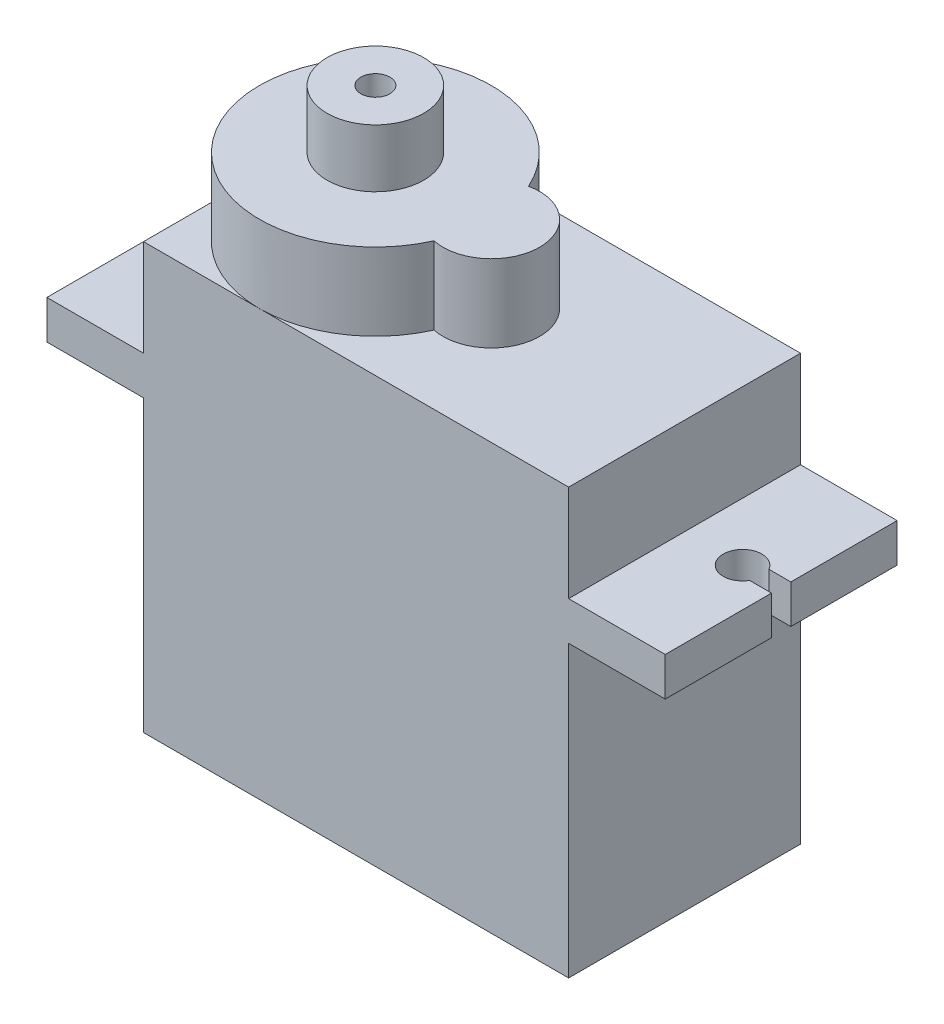
ISO-10303-21;
HEADER;
FILE_DESCRIPTION(('STEP AP214'),'2;1');
FILE_NAME('part.step','',(''),(''),'','','');
FILE_SCHEMA(('AUTOMOTIVE_DESIGN { 1 0 10303 214 1 1 1 1 }'));
ENDSEC;
DATA;
#1=APPLICATION_CONTEXT('core data for automotive mechanical design processes');
#2=APPLICATION_PROTOCOL_DEFINITION('international standard','automotive_design',2000,#1);
#3=PRODUCT_CONTEXT('',#1,'mechanical');
#4=PRODUCT('Part','Part','',(#3));
#5=PRODUCT_RELATED_PRODUCT_CATEGORY('part','',(#4));
#6=PRODUCT_DEFINITION_FORMATION('','',#4);
#7=PRODUCT_DEFINITION_CONTEXT('part definition',#1,'design');
#8=PRODUCT_DEFINITION('design','',#6,#7);
#9=PRODUCT_DEFINITION_SHAPE('','',#8);
#10=(LENGTH_UNIT() NAMED_UNIT(*) SI_UNIT(.MILLI.,.METRE.));
#11=(NAMED_UNIT(*) PLANE_ANGLE_UNIT() SI_UNIT($,.RADIAN.));
#12=(NAMED_UNIT(*) SI_UNIT($,.STERADIAN.) SOLID_ANGLE_UNIT());
#13=UNCERTAINTY_MEASURE_WITH_UNIT(LENGTH_MEASURE(1.E-05),#10,'distance_accuracy_value','');
#14=(GEOMETRIC_REPRESENTATION_CONTEXT(3) GLOBAL_UNCERTAINTY_ASSIGNED_CONTEXT((#13)) GLOBAL_UNIT_ASSIGNED_CONTEXT((#10,
#11,#12)) REPRESENTATION_CONTEXT('',''));
#15=CARTESIAN_POINT('',(0.,0.,0.));
#16=DIRECTION('',(0.,0.,1.));
#17=DIRECTION('',(1.,0.,0.));
#18=AXIS2_PLACEMENT_3D('',#15,#16,#17);
#19=CARTESIAN_POINT('',(-11.,17.,-11.3851648071345));
#20=DIRECTION('',(0.,-1.,0.));
#21=DIRECTION('',(1.,0.,0.));
#22=AXIS2_PLACEMENT_3D('',#19,#20,#21);
#23=PLANE('',#22);
#24=DIRECTION('',(-1.,0.,0.));
#25=VECTOR('',#24,1.);
#26=CARTESIAN_POINT('',(-16.,17.,0.5));
#27=LINE('',#26,#25);
#28=CARTESIAN_POINT('',(-14.8660254037844,17.,0.5));
#29=VERTEX_POINT('',#28);
#30=CARTESIAN_POINT('',(-16.,17.,0.5));
#31=VERTEX_POINT('',#30);
#32=EDGE_CURVE('E724',#29,#31,#27,.T.);
#33=ORIENTED_EDGE('',*,*,#32,.T.);
#34=DIRECTION('',(0.,0.,1.));
#35=VECTOR('',#34,1.);
#36=CARTESIAN_POINT('',(-16.,17.,-11.3851648071345));
#37=LINE('',#36,#35);
#38=CARTESIAN_POINT('',(-16.,17.,6.));
#39=VERTEX_POINT('',#38);
#40=EDGE_CURVE('E218',#31,#39,#37,.T.);
#41=ORIENTED_EDGE('',*,*,#40,.T.);
#42=DIRECTION('',(1.,0.,0.));
#43=VECTOR('',#42,1.);
#44=CARTESIAN_POINT('',(-11.,17.,6.));
#45=LINE('',#44,#43);
#46=CARTESIAN_POINT('',(-11.,17.,6.));
#47=VERTEX_POINT('',#46);
#48=EDGE_CURVE('E444',#39,#47,#45,.T.);
#49=ORIENTED_EDGE('',*,*,#48,.T.);
#50=DIRECTION('',(0.,0.,1.));
#51=VECTOR('',#50,1.);
#52=CARTESIAN_POINT('',(-11.,17.,-11.3851648071345));
#53=LINE('',#52,#51);
#54=CARTESIAN_POINT('',(-11.,17.,-6.));
#55=VERTEX_POINT('',#54);
#56=EDGE_CURVE('E235',#55,#47,#53,.T.);
#57=ORIENTED_EDGE('',*,*,#56,.F.);
#58=DIRECTION('',(-1.,0.,0.));
#59=VECTOR('',#58,1.);
#60=CARTESIAN_POINT('',(-11.,17.,-6.));
#61=LINE('',#60,#59);
#62=CARTESIAN_POINT('',(-16.,17.,-6.));
#63=VERTEX_POINT('',#62);
#64=EDGE_CURVE('E239',#55,#63,#61,.T.);
#65=ORIENTED_EDGE('',*,*,#64,.T.);
#66=CARTESIAN_POINT('',(-16.,17.,-0.5));
#67=VERTEX_POINT('',#66);
#68=EDGE_CURVE('E224',#63,#67,#37,.T.);
#69=ORIENTED_EDGE('',*,*,#68,.T.);
#70=DIRECTION('',(1.,0.,0.));
#71=VECTOR('',#70,1.);
#72=CARTESIAN_POINT('',(-14.8660254037844,17.,-0.5));
#73=LINE('',#72,#71);
#74=CARTESIAN_POINT('',(-14.8660254037844,17.,-0.5));
#75=VERTEX_POINT('',#74);
#76=EDGE_CURVE('E721',#67,#75,#73,.T.);
#77=ORIENTED_EDGE('',*,*,#76,.T.);
#78=CARTESIAN_POINT('',(-14.,17.,0.));
#79=DIRECTION('',(0.,-1.,0.));
#80=DIRECTION('',(1.,0.,0.));
#81=AXIS2_PLACEMENT_3D('',#78,#79,#80);
#82=CIRCLE('',#81,1.);
#83=EDGE_CURVE('E210',#75,#29,#82,.T.);
#84=ORIENTED_EDGE('',*,*,#83,.T.);
#85=EDGE_LOOP('',(#33,#41,#49,#57,#65,#69,#77,#84));
#86=FACE_BOUND('',#85,.T.);
#87=ADVANCED_FACE('F39',(#86),#23,.F.);
#88=CARTESIAN_POINT('',(-16.,17.,-11.3851648071345));
#89=DIRECTION('',(1.,0.,0.));
#90=DIRECTION('',(0.,0.,-1.));
#91=AXIS2_PLACEMENT_3D('',#88,#89,#90);
#92=PLANE('',#91);
#93=DIRECTION('',(0.,1.,0.));
#94=VECTOR('',#93,1.);
#95=CARTESIAN_POINT('',(-16.,-0.00100000000002182,0.5));
#96=LINE('',#95,#94);
#97=CARTESIAN_POINT('',(-16.,15.,0.5));
#98=VERTEX_POINT('',#97);
#99=EDGE_CURVE('E203',#98,#31,#96,.T.);
#100=ORIENTED_EDGE('',*,*,#99,.F.);
#101=DIRECTION('',(0.,0.,1.));
#102=VECTOR('',#101,1.);
#103=CARTESIAN_POINT('',(-16.,15.,-11.3851648071345));
#104=LINE('',#103,#102);
#105=CARTESIAN_POINT('',(-16.,15.,6.));
#106=VERTEX_POINT('',#105);
#107=EDGE_CURVE('E217',#98,#106,#104,.T.);
#108=ORIENTED_EDGE('',*,*,#107,.T.);
#109=DIRECTION('',(0.,1.,0.));
#110=VECTOR('',#109,1.);
#111=CARTESIAN_POINT('',(-16.,17.,6.));
#112=LINE('',#111,#110);
#113=EDGE_CURVE('E739',#106,#39,#112,.T.);
#114=ORIENTED_EDGE('',*,*,#113,.T.);
#115=ORIENTED_EDGE('',*,*,#40,.F.);
#116=EDGE_LOOP('',(#100,#108,#114,#115));
#117=FACE_BOUND('',#116,.T.);
#118=ADVANCED_FACE('F215',(#117),#92,.F.);
#119=DIRECTION('',(0.,1.,0.));
#120=VECTOR('',#119,1.);
#121=CARTESIAN_POINT('',(-16.,-0.00100000000002182,-0.5));
#122=LINE('',#121,#120);
#123=CARTESIAN_POINT('',(-16.,15.,-0.5));
#124=VERTEX_POINT('',#123);
#125=EDGE_CURVE('E55',#124,#67,#122,.T.);
#126=ORIENTED_EDGE('',*,*,#125,.T.);
#127=ORIENTED_EDGE('',*,*,#68,.F.);
#128=DIRECTION('',(0.,-1.,0.));
#129=VECTOR('',#128,1.);
#130=CARTESIAN_POINT('',(-16.,17.,-6.));
#131=LINE('',#130,#129);
#132=CARTESIAN_POINT('',(-16.,15.,-6.));
#133=VERTEX_POINT('',#132);
#134=EDGE_CURVE('E243',#63,#133,#131,.T.);
#135=ORIENTED_EDGE('',*,*,#134,.T.);
#136=EDGE_CURVE('E223',#133,#124,#104,.T.);
#137=ORIENTED_EDGE('',*,*,#136,.T.);
#138=EDGE_LOOP('',(#126,#127,#135,#137));
#139=FACE_BOUND('',#138,.T.);
#140=ADVANCED_FACE('F440',(#139),#92,.F.);
#141=CARTESIAN_POINT('',(-11.,15.,-11.3851648071345));
#142=DIRECTION('',(0.,1.,0.));
#143=DIRECTION('',(-1.,0.,0.));
#144=AXIS2_PLACEMENT_3D('',#141,#142,#143);
#145=PLANE('',#144);
#146=DIRECTION('',(1.,0.,0.));
#147=VECTOR('',#146,1.);
#148=CARTESIAN_POINT('',(-16.,15.,0.5));
#149=LINE('',#148,#147);
#150=CARTESIAN_POINT('',(-14.8660254037844,15.,0.500000000000002));
#151=VERTEX_POINT('',#150);
#152=EDGE_CURVE('E199',#98,#151,#149,.T.);
#153=ORIENTED_EDGE('',*,*,#152,.T.);
#154=CARTESIAN_POINT('',(-14.,15.,0.));
#155=DIRECTION('',(0.,1.,0.));
#156=DIRECTION('',(-1.,0.,0.));
#157=AXIS2_PLACEMENT_3D('',#154,#155,#156);
#158=CIRCLE('',#157,1.);
#159=CARTESIAN_POINT('',(-14.8660254037844,15.,-0.5));
#160=VERTEX_POINT('',#159);
#161=EDGE_CURVE('E211',#151,#160,#158,.T.);
#162=ORIENTED_EDGE('',*,*,#161,.T.);
#163=DIRECTION('',(-1.,0.,0.));
#164=VECTOR('',#163,1.);
#165=CARTESIAN_POINT('',(-14.8660254037844,15.,-0.5));
#166=LINE('',#165,#164);
#167=EDGE_CURVE('E729',#160,#124,#166,.T.);
#168=ORIENTED_EDGE('',*,*,#167,.T.);
#169=ORIENTED_EDGE('',*,*,#136,.F.);
#170=DIRECTION('',(1.,0.,0.));
#171=VECTOR('',#170,1.);
#172=CARTESIAN_POINT('',(-11.,15.,-6.));
#173=LINE('',#172,#171);
#174=CARTESIAN_POINT('',(-11.,15.,-6.));
#175=VERTEX_POINT('',#174);
#176=EDGE_CURVE('E249',#133,#175,#173,.T.);
#177=ORIENTED_EDGE('',*,*,#176,.T.);
#178=DIRECTION('',(0.,0.,1.));
#179=VECTOR('',#178,1.);
#180=CARTESIAN_POINT('',(-11.,15.,-11.3851648071345));
#181=LINE('',#180,#179);
#182=CARTESIAN_POINT('',(-11.,15.,6.));
#183=VERTEX_POINT('',#182);
#184=EDGE_CURVE('E229',#175,#183,#181,.T.);
#185=ORIENTED_EDGE('',*,*,#184,.T.);
#186=DIRECTION('',(-1.,0.,0.));
#187=VECTOR('',#186,1.);
#188=CARTESIAN_POINT('',(-11.,15.,6.));
#189=LINE('',#188,#187);
#190=EDGE_CURVE('E63',#183,#106,#189,.T.);
#191=ORIENTED_EDGE('',*,*,#190,.T.);
#192=ORIENTED_EDGE('',*,*,#107,.F.);
#193=EDGE_LOOP('',(#153,#162,#168,#169,#177,#185,#191,#192));
#194=FACE_BOUND('',#193,.T.);
#195=ADVANCED_FACE('F221',(#194),#145,.F.);
#196=CARTESIAN_POINT('',(-11.,22.,-6.));
#197=DIRECTION('',(1.,0.,0.));
#198=DIRECTION('',(0.,0.,-1.));
#199=AXIS2_PLACEMENT_3D('',#196,#197,#198);
#200=PLANE('',#199);
#201=ORIENTED_EDGE('',*,*,#56,.T.);
#202=DIRECTION('',(0.,-1.,0.));
#203=VECTOR('',#202,1.);
#204=CARTESIAN_POINT('',(-11.,22.,6.));
#205=LINE('',#204,#203);
#206=CARTESIAN_POINT('',(-11.,22.,6.));
#207=VERTEX_POINT('',#206);
#208=EDGE_CURVE('E384',#207,#47,#205,.T.);
#209=ORIENTED_EDGE('',*,*,#208,.F.);
#210=DIRECTION('',(0.,0.,1.));
#211=VECTOR('',#210,1.);
#212=CARTESIAN_POINT('',(-11.,22.,-6.));
#213=LINE('',#212,#211);
#214=CARTESIAN_POINT('',(-11.,22.,0.));
#215=VERTEX_POINT('',#214);
#216=EDGE_CURVE('E355',#215,#207,#213,.T.);
#217=ORIENTED_EDGE('',*,*,#216,.F.);
#218=CARTESIAN_POINT('',(-11.,22.,-6.));
#219=VERTEX_POINT('',#218);
#220=EDGE_CURVE('E356',#219,#215,#213,.T.);
#221=ORIENTED_EDGE('',*,*,#220,.F.);
#222=DIRECTION('',(0.,-1.,0.));
#223=VECTOR('',#222,1.);
#224=CARTESIAN_POINT('',(-11.,22.,-6.));
#225=LINE('',#224,#223);
#226=EDGE_CURVE('E389',#219,#55,#225,.T.);
#227=ORIENTED_EDGE('',*,*,#226,.T.);
#228=EDGE_LOOP('',(#201,#209,#217,#221,#227));
#229=FACE_BOUND('',#228,.T.);
#230=ADVANCED_FACE('F448',(#229),#200,.F.);
#231=ORIENTED_EDGE('',*,*,#184,.F.);
#232=CARTESIAN_POINT('',(-11.,0.,-6.));
#233=VERTEX_POINT('',#232);
#234=EDGE_CURVE('E388',#175,#233,#225,.T.);
#235=ORIENTED_EDGE('',*,*,#234,.T.);
#236=DIRECTION('',(0.,0.,1.));
#237=VECTOR('',#236,1.);
#238=CARTESIAN_POINT('',(-11.,0.,-6.));
#239=LINE('',#238,#237);
#240=CARTESIAN_POINT('',(-11.,0.,6.));
#241=VERTEX_POINT('',#240);
#242=EDGE_CURVE('E373',#233,#241,#239,.T.);
#243=ORIENTED_EDGE('',*,*,#242,.T.);
#244=EDGE_CURVE('E383',#183,#241,#205,.T.);
#245=ORIENTED_EDGE('',*,*,#244,.F.);
#246=EDGE_LOOP('',(#231,#235,#243,#245));
#247=FACE_BOUND('',#246,.T.);
#248=ADVANCED_FACE('F422',(#247),#200,.F.);
#249=CARTESIAN_POINT('',(16.,17.,-11.3851648071345));
#250=DIRECTION('',(1.,0.,0.));
#251=DIRECTION('',(0.,0.,-1.));
#252=AXIS2_PLACEMENT_3D('',#249,#250,#251);
#253=PLANE('',#252);
#254=DIRECTION('',(0.,1.,0.));
#255=VECTOR('',#254,1.);
#256=CARTESIAN_POINT('',(16.,-0.00100000000001835,-0.5));
#257=LINE('',#256,#255);
#258=CARTESIAN_POINT('',(16.,15.,-0.5));
#259=VERTEX_POINT('',#258);
#260=CARTESIAN_POINT('',(16.,17.,-0.5));
#261=VERTEX_POINT('',#260);
#262=EDGE_CURVE('E269',#259,#261,#257,.T.);
#263=ORIENTED_EDGE('',*,*,#262,.F.);
#264=DIRECTION('',(0.,0.,1.));
#265=VECTOR('',#264,1.);
#266=CARTESIAN_POINT('',(16.,15.,-11.3851648071345));
#267=LINE('',#266,#265);
#268=CARTESIAN_POINT('',(16.,15.,-6.));
#269=VERTEX_POINT('',#268);
#270=EDGE_CURVE('E310',#269,#259,#267,.T.);
#271=ORIENTED_EDGE('',*,*,#270,.F.);
#272=DIRECTION('',(0.,-1.,0.));
#273=VECTOR('',#272,1.);
#274=CARTESIAN_POINT('',(16.,17.,-6.));
#275=LINE('',#274,#273);
#276=CARTESIAN_POINT('',(16.,17.,-6.));
#277=VERTEX_POINT('',#276);
#278=EDGE_CURVE('E282',#277,#269,#275,.T.);
#279=ORIENTED_EDGE('',*,*,#278,.F.);
#280=DIRECTION('',(0.,0.,1.));
#281=VECTOR('',#280,1.);
#282=CARTESIAN_POINT('',(16.,17.,-11.3851648071345));
#283=LINE('',#282,#281);
#284=EDGE_CURVE('E305',#277,#261,#283,.T.);
#285=ORIENTED_EDGE('',*,*,#284,.T.);
#286=EDGE_LOOP('',(#263,#271,#279,#285));
#287=FACE_BOUND('',#286,.T.);
#288=ADVANCED_FACE('F512',(#287),#253,.T.);
#289=CARTESIAN_POINT('',(11.,22.,-6.));
#290=DIRECTION('',(-1.,0.,0.));
#291=DIRECTION('',(0.,0.,1.));
#292=AXIS2_PLACEMENT_3D('',#289,#290,#291);
#293=PLANE('',#292);
#294=DIRECTION('',(0.,0.,1.));
#295=VECTOR('',#294,1.);
#296=CARTESIAN_POINT('',(11.,17.,-11.3851648071345));
#297=LINE('',#296,#295);
#298=CARTESIAN_POINT('',(11.,17.,-6.));
#299=VERTEX_POINT('',#298);
#300=CARTESIAN_POINT('',(11.,17.,6.));
#301=VERTEX_POINT('',#300);
#302=EDGE_CURVE('E286',#299,#301,#297,.T.);
#303=ORIENTED_EDGE('',*,*,#302,.F.);
#304=DIRECTION('',(0.,-1.,0.));
#305=VECTOR('',#304,1.);
#306=CARTESIAN_POINT('',(11.,22.,-6.));
#307=LINE('',#306,#305);
#308=CARTESIAN_POINT('',(11.,22.,-6.));
#309=VERTEX_POINT('',#308);
#310=EDGE_CURVE('E393',#309,#299,#307,.T.);
#311=ORIENTED_EDGE('',*,*,#310,.F.);
#312=DIRECTION('',(0.,0.,-1.));
#313=VECTOR('',#312,1.);
#314=CARTESIAN_POINT('',(11.,22.,-6.));
#315=LINE('',#314,#313);
#316=CARTESIAN_POINT('',(11.,22.,6.));
#317=VERTEX_POINT('',#316);
#318=EDGE_CURVE('E345',#317,#309,#315,.T.);
#319=ORIENTED_EDGE('',*,*,#318,.F.);
#320=DIRECTION('',(0.,-1.,0.));
#321=VECTOR('',#320,1.);
#322=CARTESIAN_POINT('',(11.,22.,6.));
#323=LINE('',#322,#321);
#324=EDGE_CURVE('E380',#317,#301,#323,.T.);
#325=ORIENTED_EDGE('',*,*,#324,.T.);
#326=EDGE_LOOP('',(#303,#311,#319,#325));
#327=FACE_BOUND('',#326,.T.);
#328=ADVANCED_FACE('F477',(#327),#293,.F.);
#329=CARTESIAN_POINT('',(0.,22.,0.));
#330=DIRECTION('',(0.,1.,0.));
#331=DIRECTION('',(0.,0.,1.));
#332=AXIS2_PLACEMENT_3D('',#329,#330,#331);
#333=PLANE('',#332);
#334=CARTESIAN_POINT('',(0.999999999999997,22.,0.));
#335=DIRECTION('',(0.,1.,0.));
#336=DIRECTION('',(0.,0.,1.));
#337=AXIS2_PLACEMENT_3D('',#334,#335,#336);
#338=CIRCLE('',#337,2.5);
#339=CARTESIAN_POINT('',(0.479166666666664,22.,2.44514470714698));
#340=VERTEX_POINT('',#339);
#341=CARTESIAN_POINT('',(0.479166666666665,22.,-2.44514470714698));
#342=VERTEX_POINT('',#341);
#343=EDGE_CURVE('E320',#340,#342,#338,.T.);
#344=ORIENTED_EDGE('',*,*,#343,.F.);
#345=CARTESIAN_POINT('',(-5.,22.,0.));
#346=DIRECTION('',(0.,1.,0.));
#347=DIRECTION('',(0.,0.,1.));
#348=AXIS2_PLACEMENT_3D('',#345,#346,#347);
#349=CIRCLE('',#348,6.);
#350=CARTESIAN_POINT('',(-5.,22.,6.));
#351=VERTEX_POINT('',#350);
#352=EDGE_CURVE('E336',#351,#340,#349,.T.);
#353=ORIENTED_EDGE('',*,*,#352,.F.);
#354=DIRECTION('',(1.,0.,0.));
#355=VECTOR('',#354,1.);
#356=CARTESIAN_POINT('',(-11.,22.,6.));
#357=LINE('',#356,#355);
#358=EDGE_CURVE('E360',#351,#317,#357,.T.);
#359=ORIENTED_EDGE('',*,*,#358,.T.);
#360=ORIENTED_EDGE('',*,*,#318,.T.);
#361=DIRECTION('',(-1.,0.,0.));
#362=VECTOR('',#361,1.);
#363=CARTESIAN_POINT('',(-11.,22.,-6.));
#364=LINE('',#363,#362);
#365=CARTESIAN_POINT('',(-5.,22.,-6.));
#366=VERTEX_POINT('',#365);
#367=EDGE_CURVE('E351',#309,#366,#364,.T.);
#368=ORIENTED_EDGE('',*,*,#367,.T.);
#369=EDGE_CURVE('E326',#342,#366,#349,.T.);
#370=ORIENTED_EDGE('',*,*,#369,.F.);
#371=EDGE_LOOP('',(#344,#353,#359,#360,#368,#370));
#372=FACE_BOUND('',#371,.T.);
#373=ADVANCED_FACE('F453',(#372),#333,.T.);
#374=EDGE_CURVE('E48',#366,#215,#349,.T.);
#375=ORIENTED_EDGE('',*,*,#374,.F.);
#376=EDGE_CURVE('E349',#366,#219,#364,.T.);
#377=ORIENTED_EDGE('',*,*,#376,.T.);
#378=ORIENTED_EDGE('',*,*,#220,.T.);
#379=EDGE_LOOP('',(#375,#377,#378));
#380=FACE_BOUND('',#379,.T.);
#381=ADVANCED_FACE('F470',(#380),#333,.T.);
#382=CARTESIAN_POINT('',(11.,15.,-6.));
#383=VERTEX_POINT('',#382);
#384=CARTESIAN_POINT('',(11.,0.,-6.));
#385=VERTEX_POINT('',#384);
#386=EDGE_CURVE('E392',#383,#385,#307,.T.);
#387=ORIENTED_EDGE('',*,*,#386,.F.);
#388=DIRECTION('',(0.,0.,1.));
#389=VECTOR('',#388,1.);
#390=CARTESIAN_POINT('',(11.,15.,-11.3851648071345));
#391=LINE('',#390,#389);
#392=CARTESIAN_POINT('',(11.,15.,6.));
#393=VERTEX_POINT('',#392);
#394=EDGE_CURVE('E301',#383,#393,#391,.T.);
#395=ORIENTED_EDGE('',*,*,#394,.T.);
#396=CARTESIAN_POINT('',(11.,0.,6.));
#397=VERTEX_POINT('',#396);
#398=EDGE_CURVE('E365',#393,#397,#323,.T.);
#399=ORIENTED_EDGE('',*,*,#398,.T.);
#400=DIRECTION('',(0.,0.,-1.));
#401=VECTOR('',#400,1.);
#402=CARTESIAN_POINT('',(11.,0.,-6.));
#403=LINE('',#402,#401);
#404=EDGE_CURVE('E344',#397,#385,#403,.T.);
#405=ORIENTED_EDGE('',*,*,#404,.T.);
#406=EDGE_LOOP('',(#387,#395,#399,#405));
#407=FACE_BOUND('',#406,.T.);
#408=ADVANCED_FACE('F41',(#407),#293,.F.);
#409=CARTESIAN_POINT('',(-11.,22.,-6.));
#410=DIRECTION('',(0.,0.,1.));
#411=DIRECTION('',(1.,0.,0.));
#412=AXIS2_PLACEMENT_3D('',#409,#410,#411);
#413=PLANE('',#412);
#414=DIRECTION('',(-1.,0.,0.));
#415=VECTOR('',#414,1.);
#416=CARTESIAN_POINT('',(-11.,0.,-6.));
#417=LINE('',#416,#415);
#418=EDGE_CURVE('E369',#385,#233,#417,.T.);
#419=ORIENTED_EDGE('',*,*,#418,.T.);
#420=ORIENTED_EDGE('',*,*,#234,.F.);
#421=ORIENTED_EDGE('',*,*,#176,.F.);
#422=ORIENTED_EDGE('',*,*,#134,.F.);
#423=ORIENTED_EDGE('',*,*,#64,.F.);
#424=ORIENTED_EDGE('',*,*,#226,.F.);
#425=ORIENTED_EDGE('',*,*,#376,.F.);
#426=ORIENTED_EDGE('',*,*,#367,.F.);
#427=ORIENTED_EDGE('',*,*,#310,.T.);
#428=DIRECTION('',(1.,0.,0.));
#429=VECTOR('',#428,1.);
#430=CARTESIAN_POINT('',(11.,17.,-6.));
#431=LINE('',#430,#429);
#432=EDGE_CURVE('E285',#299,#277,#431,.T.);
#433=ORIENTED_EDGE('',*,*,#432,.T.);
#434=ORIENTED_EDGE('',*,*,#278,.T.);
#435=DIRECTION('',(-1.,0.,0.));
#436=VECTOR('',#435,1.);
#437=CARTESIAN_POINT('',(11.,15.,-6.));
#438=LINE('',#437,#436);
#439=EDGE_CURVE('E289',#269,#383,#438,.T.);
#440=ORIENTED_EDGE('',*,*,#439,.T.);
#441=ORIENTED_EDGE('',*,*,#386,.T.);
#442=EDGE_LOOP('',(#419,#420,#421,#422,#423,#424,#425,#426,#427,#433,#434,#440,#441));
#443=FACE_BOUND('',#442,.T.);
#444=ADVANCED_FACE('F404',(#443),#413,.F.);
#445=CARTESIAN_POINT('',(-11.,22.,6.));
#446=DIRECTION('',(0.,0.,-1.));
#447=DIRECTION('',(-1.,0.,0.));
#448=AXIS2_PLACEMENT_3D('',#445,#446,#447);
#449=PLANE('',#448);
#450=DIRECTION('',(1.,0.,0.));
#451=VECTOR('',#450,1.);
#452=CARTESIAN_POINT('',(-11.,0.,6.));
#453=LINE('',#452,#451);
#454=EDGE_CURVE('E350',#241,#397,#453,.T.);
#455=ORIENTED_EDGE('',*,*,#454,.T.);
#456=ORIENTED_EDGE('',*,*,#398,.F.);
#457=DIRECTION('',(1.,0.,0.));
#458=VECTOR('',#457,1.);
#459=CARTESIAN_POINT('',(11.,15.,6.));
#460=LINE('',#459,#458);
#461=CARTESIAN_POINT('',(16.,15.,6.));
#462=VERTEX_POINT('',#461);
#463=EDGE_CURVE('E281',#393,#462,#460,.T.);
#464=ORIENTED_EDGE('',*,*,#463,.T.);
#465=DIRECTION('',(0.,1.,0.));
#466=VECTOR('',#465,1.);
#467=CARTESIAN_POINT('',(16.,17.,6.));
#468=LINE('',#467,#466);
#469=CARTESIAN_POINT('',(16.,17.,6.));
#470=VERTEX_POINT('',#469);
#471=EDGE_CURVE('E293',#462,#470,#468,.T.);
#472=ORIENTED_EDGE('',*,*,#471,.T.);
#473=DIRECTION('',(-1.,0.,0.));
#474=VECTOR('',#473,1.);
#475=CARTESIAN_POINT('',(11.,17.,6.));
#476=LINE('',#475,#474);
#477=EDGE_CURVE('E297',#470,#301,#476,.T.);
#478=ORIENTED_EDGE('',*,*,#477,.T.);
#479=ORIENTED_EDGE('',*,*,#324,.F.);
#480=ORIENTED_EDGE('',*,*,#358,.F.);
#481=EDGE_CURVE('E361',#207,#351,#357,.T.);
#482=ORIENTED_EDGE('',*,*,#481,.F.);
#483=ORIENTED_EDGE('',*,*,#208,.T.);
#484=ORIENTED_EDGE('',*,*,#48,.F.);
#485=ORIENTED_EDGE('',*,*,#113,.F.);
#486=ORIENTED_EDGE('',*,*,#190,.F.);
#487=ORIENTED_EDGE('',*,*,#244,.T.);
#488=EDGE_LOOP('',(#455,#456,#464,#472,#478,#479,#480,#482,#483,#484,#485,#486,#487));
#489=FACE_BOUND('',#488,.T.);
#490=ADVANCED_FACE('F417',(#489),#449,.F.);
#491=EDGE_CURVE('E402',#215,#351,#349,.T.);
#492=ORIENTED_EDGE('',*,*,#491,.F.);
#493=ORIENTED_EDGE('',*,*,#216,.T.);
#494=ORIENTED_EDGE('',*,*,#481,.T.);
#495=EDGE_LOOP('',(#492,#493,#494));
#496=FACE_BOUND('',#495,.T.);
#497=ADVANCED_FACE('F468',(#496),#333,.T.);
#498=CARTESIAN_POINT('',(0.,0.,0.));
#499=DIRECTION('',(0.,1.,0.));
#500=DIRECTION('',(0.,0.,1.));
#501=AXIS2_PLACEMENT_3D('',#498,#499,#500);
#502=PLANE('',#501);
#503=ORIENTED_EDGE('',*,*,#404,.F.);
#504=ORIENTED_EDGE('',*,*,#454,.F.);
#505=ORIENTED_EDGE('',*,*,#242,.F.);
#506=ORIENTED_EDGE('',*,*,#418,.F.);
#507=EDGE_LOOP('',(#503,#504,#505,#506));
#508=FACE_BOUND('',#507,.T.);
#509=ADVANCED_FACE('F412',(#508),#502,.F.);
#510=CARTESIAN_POINT('',(0.999999999999997,26.,0.));
#511=DIRECTION('',(0.,-1.,0.));
#512=DIRECTION('',(0.,0.,-1.));
#513=AXIS2_PLACEMENT_3D('',#510,#511,#512);
#514=CYLINDRICAL_SURFACE('',#513,2.5);
#515=ORIENTED_EDGE('',*,*,#343,.T.);
#516=DIRECTION('',(0.,-1.,0.));
#517=VECTOR('',#516,1.);
#518=CARTESIAN_POINT('',(0.479166666666665,26.,-2.44514470714698));
#519=LINE('',#518,#517);
#520=CARTESIAN_POINT('',(0.479166666666665,26.,-2.44514470714698));
#521=VERTEX_POINT('',#520);
#522=EDGE_CURVE('E340',#521,#342,#519,.T.);
#523=ORIENTED_EDGE('',*,*,#522,.F.);
#524=CARTESIAN_POINT('',(0.999999999999997,26.,0.));
#525=DIRECTION('',(0.,1.,0.));
#526=DIRECTION('',(0.,0.,1.));
#527=AXIS2_PLACEMENT_3D('',#524,#525,#526);
#528=CIRCLE('',#527,2.5);
#529=CARTESIAN_POINT('',(0.479166666666664,26.,2.44514470714698));
#530=VERTEX_POINT('',#529);
#531=EDGE_CURVE('E321',#530,#521,#528,.T.);
#532=ORIENTED_EDGE('',*,*,#531,.F.);
#533=DIRECTION('',(0.,-1.,0.));
#534=VECTOR('',#533,1.);
#535=CARTESIAN_POINT('',(0.479166666666664,26.,2.44514470714698));
#536=LINE('',#535,#534);
#537=EDGE_CURVE('E329',#530,#340,#536,.T.);
#538=ORIENTED_EDGE('',*,*,#537,.T.);
#539=EDGE_LOOP('',(#515,#523,#532,#538));
#540=FACE_BOUND('',#539,.T.);
#541=ADVANCED_FACE('F463',(#540),#514,.T.);
#542=CARTESIAN_POINT('',(-5.,26.,0.));
#543=DIRECTION('',(0.,-1.,0.));
#544=DIRECTION('',(0.,0.,-1.));
#545=AXIS2_PLACEMENT_3D('',#542,#543,#544);
#546=CYLINDRICAL_SURFACE('',#545,6.);
#547=ORIENTED_EDGE('',*,*,#369,.T.);
#548=ORIENTED_EDGE('',*,*,#374,.T.);
#549=ORIENTED_EDGE('',*,*,#491,.T.);
#550=ORIENTED_EDGE('',*,*,#352,.T.);
#551=ORIENTED_EDGE('',*,*,#537,.F.);
#552=CARTESIAN_POINT('',(-5.,26.,0.));
#553=DIRECTION('',(0.,1.,0.));
#554=DIRECTION('',(0.,0.,1.));
#555=AXIS2_PLACEMENT_3D('',#552,#553,#554);
#556=CIRCLE('',#555,6.);
#557=EDGE_CURVE('E325',#521,#530,#556,.T.);
#558=ORIENTED_EDGE('',*,*,#557,.F.);
#559=ORIENTED_EDGE('',*,*,#522,.T.);
#560=EDGE_LOOP('',(#547,#548,#549,#550,#551,#558,#559));
#561=FACE_BOUND('',#560,.T.);
#562=ADVANCED_FACE('F457',(#561),#546,.T.);
#563=CARTESIAN_POINT('',(-2.,26.,0.));
#564=DIRECTION('',(0.,1.,0.));
#565=DIRECTION('',(0.,0.,1.));
#566=AXIS2_PLACEMENT_3D('',#563,#564,#565);
#567=PLANE('',#566);
#568=CARTESIAN_POINT('',(-5.,26.,0.));
#569=DIRECTION('',(0.,1.,0.));
#570=DIRECTION('',(0.,0.,1.));
#571=AXIS2_PLACEMENT_3D('',#568,#569,#570);
#572=CIRCLE('',#571,2.5);
#573=CARTESIAN_POINT('',(-5.,26.,2.5));
#574=VERTEX_POINT('',#573);
#575=EDGE_CURVE('E706',#574,#574,#572,.T.);
#576=ORIENTED_EDGE('',*,*,#575,.F.);
#577=EDGE_LOOP('',(#576));
#578=FACE_BOUND('',#577,.T.);
#579=ORIENTED_EDGE('',*,*,#531,.T.);
#580=ORIENTED_EDGE('',*,*,#557,.T.);
#581=EDGE_LOOP('',(#579,#580));
#582=FACE_BOUND('',#581,.T.);
#583=ADVANCED_FACE('F507',(#578,#582),#567,.T.);
#584=CARTESIAN_POINT('',(11.,17.,-11.3851648071345));
#585=DIRECTION('',(0.,1.,0.));
#586=DIRECTION('',(-1.,0.,0.));
#587=AXIS2_PLACEMENT_3D('',#584,#585,#586);
#588=PLANE('',#587);
#589=DIRECTION('',(-1.,0.,0.));
#590=VECTOR('',#589,1.);
#591=CARTESIAN_POINT('',(14.8660254037844,17.,-0.5));
#592=LINE('',#591,#590);
#593=CARTESIAN_POINT('',(14.8660254037844,17.,-0.5));
#594=VERTEX_POINT('',#593);
#595=EDGE_CURVE('E260',#261,#594,#592,.T.);
#596=ORIENTED_EDGE('',*,*,#595,.F.);
#597=ORIENTED_EDGE('',*,*,#284,.F.);
#598=ORIENTED_EDGE('',*,*,#432,.F.);
#599=ORIENTED_EDGE('',*,*,#302,.T.);
#600=ORIENTED_EDGE('',*,*,#477,.F.);
#601=CARTESIAN_POINT('',(16.,17.,0.5));
#602=VERTEX_POINT('',#601);
#603=EDGE_CURVE('E309',#602,#470,#283,.T.);
#604=ORIENTED_EDGE('',*,*,#603,.F.);
#605=DIRECTION('',(1.,0.,0.));
#606=VECTOR('',#605,1.);
#607=CARTESIAN_POINT('',(16.,17.,0.5));
#608=LINE('',#607,#606);
#609=CARTESIAN_POINT('',(14.8660254037844,17.,0.5));
#610=VERTEX_POINT('',#609);
#611=EDGE_CURVE('E257',#610,#602,#608,.T.);
#612=ORIENTED_EDGE('',*,*,#611,.F.);
#613=CARTESIAN_POINT('',(14.,17.,0.));
#614=DIRECTION('',(0.,1.,0.));
#615=DIRECTION('',(-1.,0.,0.));
#616=AXIS2_PLACEMENT_3D('',#613,#614,#615);
#617=CIRCLE('',#616,1.);
#618=EDGE_CURVE('E253',#594,#610,#617,.T.);
#619=ORIENTED_EDGE('',*,*,#618,.F.);
#620=EDGE_LOOP('',(#596,#597,#598,#599,#600,#604,#612,#619));
#621=FACE_BOUND('',#620,.T.);
#622=ADVANCED_FACE('F503',(#621),#588,.T.);
#623=DIRECTION('',(0.,1.,0.));
#624=VECTOR('',#623,1.);
#625=CARTESIAN_POINT('',(16.,-0.00100000000001835,0.5));
#626=LINE('',#625,#624);
#627=CARTESIAN_POINT('',(16.,15.,0.5));
#628=VERTEX_POINT('',#627);
#629=EDGE_CURVE('E272',#628,#602,#626,.T.);
#630=ORIENTED_EDGE('',*,*,#629,.T.);
#631=ORIENTED_EDGE('',*,*,#603,.T.);
#632=ORIENTED_EDGE('',*,*,#471,.F.);
#633=EDGE_CURVE('E314',#628,#462,#267,.T.);
#634=ORIENTED_EDGE('',*,*,#633,.F.);
#635=EDGE_LOOP('',(#630,#631,#632,#634));
#636=FACE_BOUND('',#635,.T.);
#637=ADVANCED_FACE('F506',(#636),#253,.T.);
#638=CARTESIAN_POINT('',(11.,15.,-11.3851648071345));
#639=DIRECTION('',(0.,-1.,0.));
#640=DIRECTION('',(1.,0.,0.));
#641=AXIS2_PLACEMENT_3D('',#638,#639,#640);
#642=PLANE('',#641);
#643=DIRECTION('',(-1.,0.,0.));
#644=VECTOR('',#643,1.);
#645=CARTESIAN_POINT('',(14.8660254037844,15.,-0.5));
#646=LINE('',#645,#644);
#647=CARTESIAN_POINT('',(14.8660254037844,15.,-0.500000000000002));
#648=VERTEX_POINT('',#647);
#649=EDGE_CURVE('E248',#259,#648,#646,.T.);
#650=ORIENTED_EDGE('',*,*,#649,.T.);
#651=CARTESIAN_POINT('',(14.,15.,0.));
#652=DIRECTION('',(0.,-1.,0.));
#653=DIRECTION('',(1.,0.,0.));
#654=AXIS2_PLACEMENT_3D('',#651,#652,#653);
#655=CIRCLE('',#654,1.);
#656=CARTESIAN_POINT('',(14.8660254037844,15.,0.5));
#657=VERTEX_POINT('',#656);
#658=EDGE_CURVE('E244',#648,#657,#655,.F.);
#659=ORIENTED_EDGE('',*,*,#658,.T.);
#660=DIRECTION('',(1.,0.,0.));
#661=VECTOR('',#660,1.);
#662=CARTESIAN_POINT('',(16.,15.,0.5));
#663=LINE('',#662,#661);
#664=EDGE_CURVE('E268',#657,#628,#663,.T.);
#665=ORIENTED_EDGE('',*,*,#664,.T.);
#666=ORIENTED_EDGE('',*,*,#633,.T.);
#667=ORIENTED_EDGE('',*,*,#463,.F.);
#668=ORIENTED_EDGE('',*,*,#394,.F.);
#669=ORIENTED_EDGE('',*,*,#439,.F.);
#670=ORIENTED_EDGE('',*,*,#270,.T.);
#671=EDGE_LOOP('',(#650,#659,#665,#666,#667,#668,#669,#670));
#672=FACE_BOUND('',#671,.T.);
#673=ADVANCED_FACE('F501',(#672),#642,.T.);
#674=CARTESIAN_POINT('',(14.,-0.00100000000001835,0.));
#675=DIRECTION('',(0.,1.,0.));
#676=DIRECTION('',(-1.,0.,0.));
#677=AXIS2_PLACEMENT_3D('',#674,#675,#676);
#678=CYLINDRICAL_SURFACE('',#677,1.);
#679=DIRECTION('',(0.,1.,0.));
#680=VECTOR('',#679,1.);
#681=CARTESIAN_POINT('',(14.8660254037844,-0.00100000000001835,-0.5));
#682=LINE('',#681,#680);
#683=EDGE_CURVE('E265',#648,#594,#682,.T.);
#684=ORIENTED_EDGE('',*,*,#683,.T.);
#685=ORIENTED_EDGE('',*,*,#618,.T.);
#686=DIRECTION('',(0.,1.,0.));
#687=VECTOR('',#686,1.);
#688=CARTESIAN_POINT('',(14.8660254037844,-0.00100000000001835,0.5));
#689=LINE('',#688,#687);
#690=EDGE_CURVE('E264',#657,#610,#689,.T.);
#691=ORIENTED_EDGE('',*,*,#690,.F.);
#692=ORIENTED_EDGE('',*,*,#658,.F.);
#693=EDGE_LOOP('',(#684,#685,#691,#692));
#694=FACE_BOUND('',#693,.T.);
#695=ADVANCED_FACE('F493',(#694),#678,.F.);
#696=CARTESIAN_POINT('',(14.8660254037844,-0.00100000000001835,-0.5));
#697=DIRECTION('',(0.,0.,-1.));
#698=DIRECTION('',(-1.,0.,0.));
#699=AXIS2_PLACEMENT_3D('',#696,#697,#698);
#700=PLANE('',#699);
#701=ORIENTED_EDGE('',*,*,#262,.T.);
#702=ORIENTED_EDGE('',*,*,#595,.T.);
#703=ORIENTED_EDGE('',*,*,#683,.F.);
#704=ORIENTED_EDGE('',*,*,#649,.F.);
#705=EDGE_LOOP('',(#701,#702,#703,#704));
#706=FACE_BOUND('',#705,.T.);
#707=ADVANCED_FACE('F489',(#706),#700,.F.);
#708=CARTESIAN_POINT('',(16.,-0.00100000000001835,0.5));
#709=DIRECTION('',(0.,0.,1.));
#710=DIRECTION('',(1.,0.,0.));
#711=AXIS2_PLACEMENT_3D('',#708,#709,#710);
#712=PLANE('',#711);
#713=ORIENTED_EDGE('',*,*,#690,.T.);
#714=ORIENTED_EDGE('',*,*,#611,.T.);
#715=ORIENTED_EDGE('',*,*,#629,.F.);
#716=ORIENTED_EDGE('',*,*,#664,.F.);
#717=EDGE_LOOP('',(#713,#714,#715,#716));
#718=FACE_BOUND('',#717,.T.);
#719=ADVANCED_FACE('F492',(#718),#712,.F.);
#720=CARTESIAN_POINT('',(-14.,-0.00100000000002182,0.));
#721=DIRECTION('',(0.,1.,0.));
#722=DIRECTION('',(-1.,0.,0.));
#723=AXIS2_PLACEMENT_3D('',#720,#721,#722);
#724=CYLINDRICAL_SURFACE('',#723,1.);
#725=DIRECTION('',(0.,1.,0.));
#726=VECTOR('',#725,1.);
#727=CARTESIAN_POINT('',(-14.8660254037844,-0.00100000000002182,0.5));
#728=LINE('',#727,#726);
#729=EDGE_CURVE('E205',#151,#29,#728,.T.);
#730=ORIENTED_EDGE('',*,*,#729,.T.);
#731=ORIENTED_EDGE('',*,*,#83,.F.);
#732=DIRECTION('',(0.,1.,0.));
#733=VECTOR('',#732,1.);
#734=CARTESIAN_POINT('',(-14.8660254037844,-0.00100000000002182,-0.5));
#735=LINE('',#734,#733);
#736=EDGE_CURVE('E727',#160,#75,#735,.T.);
#737=ORIENTED_EDGE('',*,*,#736,.F.);
#738=ORIENTED_EDGE('',*,*,#161,.F.);
#739=EDGE_LOOP('',(#730,#731,#737,#738));
#740=FACE_BOUND('',#739,.T.);
#741=ADVANCED_FACE('F497',(#740),#724,.F.);
#742=CARTESIAN_POINT('',(-16.,-0.00100000000002182,0.5));
#743=DIRECTION('',(0.,0.,-1.));
#744=DIRECTION('',(-1.,0.,0.));
#745=AXIS2_PLACEMENT_3D('',#742,#743,#744);
#746=PLANE('',#745);
#747=ORIENTED_EDGE('',*,*,#99,.T.);
#748=ORIENTED_EDGE('',*,*,#32,.F.);
#749=ORIENTED_EDGE('',*,*,#729,.F.);
#750=ORIENTED_EDGE('',*,*,#152,.F.);
#751=EDGE_LOOP('',(#747,#748,#749,#750));
#752=FACE_BOUND('',#751,.T.);
#753=ADVANCED_FACE('F201',(#752),#746,.T.);
#754=CARTESIAN_POINT('',(-14.8660254037844,-0.00100000000002182,-0.5));
#755=DIRECTION('',(0.,0.,1.));
#756=DIRECTION('',(1.,0.,0.));
#757=AXIS2_PLACEMENT_3D('',#754,#755,#756);
#758=PLANE('',#757);
#759=ORIENTED_EDGE('',*,*,#736,.T.);
#760=ORIENTED_EDGE('',*,*,#76,.F.);
#761=ORIENTED_EDGE('',*,*,#125,.F.);
#762=ORIENTED_EDGE('',*,*,#167,.F.);
#763=EDGE_LOOP('',(#759,#760,#761,#762));
#764=FACE_BOUND('',#763,.T.);
#765=ADVANCED_FACE('F679',(#764),#758,.T.);
#766=CARTESIAN_POINT('',(-5.,29.,0.));
#767=DIRECTION('',(0.,1.,0.));
#768=DIRECTION('',(0.,0.,1.));
#769=AXIS2_PLACEMENT_3D('',#766,#767,#768);
#770=PLANE('',#769);
#771=CARTESIAN_POINT('',(-5.,29.,0.));
#772=DIRECTION('',(0.,1.,0.));
#773=DIRECTION('',(0.,0.,1.));
#774=AXIS2_PLACEMENT_3D('',#771,#772,#773);
#775=CIRCLE('',#774,2.5);
#776=CARTESIAN_POINT('',(-5.,29.,2.5));
#777=VERTEX_POINT('',#776);
#778=EDGE_CURVE('E710',#777,#777,#775,.T.);
#779=ORIENTED_EDGE('',*,*,#778,.T.);
#780=EDGE_LOOP('',(#779));
#781=FACE_BOUND('',#780,.T.);
#782=CARTESIAN_POINT('',(-5.,29.,0.));
#783=DIRECTION('',(0.,1.,0.));
#784=DIRECTION('',(0.,0.,1.));
#785=AXIS2_PLACEMENT_3D('',#782,#783,#784);
#786=CIRCLE('',#785,0.75);
#787=CARTESIAN_POINT('',(-5.,29.,0.750000000000002));
#788=VERTEX_POINT('',#787);
#789=EDGE_CURVE('E702',#788,#788,#786,.T.);
#790=ORIENTED_EDGE('',*,*,#789,.F.);
#791=EDGE_LOOP('',(#790));
#792=FACE_BOUND('',#791,.T.);
#793=ADVANCED_FACE('F682',(#781,#792),#770,.T.);
#794=CARTESIAN_POINT('',(-5.,29.,0.));
#795=DIRECTION('',(0.,-1.,0.));
#796=DIRECTION('',(0.,0.,-1.));
#797=AXIS2_PLACEMENT_3D('',#794,#795,#796);
#798=CYLINDRICAL_SURFACE('',#797,2.5);
#799=ORIENTED_EDGE('',*,*,#778,.F.);
#800=EDGE_LOOP('',(#799));
#801=FACE_BOUND('',#800,.T.);
#802=ORIENTED_EDGE('',*,*,#575,.T.);
#803=EDGE_LOOP('',(#802));
#804=FACE_BOUND('',#803,.T.);
#805=ADVANCED_FACE('F685',(#801,#804),#798,.T.);
#806=CARTESIAN_POINT('',(-5.,29.,0.));
#807=DIRECTION('',(0.,-1.,0.));
#808=DIRECTION('',(0.,0.,-1.));
#809=AXIS2_PLACEMENT_3D('',#806,#807,#808);
#810=CYLINDRICAL_SURFACE('',#809,0.75);
#811=ORIENTED_EDGE('',*,*,#789,.T.);
#812=EDGE_LOOP('',(#811));
#813=FACE_BOUND('',#812,.T.);
#814=CARTESIAN_POINT('',(-5.,26.,0.));
#815=DIRECTION('',(0.,1.,0.));
#816=DIRECTION('',(0.,0.,1.));
#817=AXIS2_PLACEMENT_3D('',#814,#815,#816);
#818=CIRCLE('',#817,0.75);
#819=CARTESIAN_POINT('',(-5.,26.,0.750000000000002));
#820=VERTEX_POINT('',#819);
#821=EDGE_CURVE('E11',#820,#820,#818,.F.);
#822=ORIENTED_EDGE('',*,*,#821,.T.);
#823=EDGE_LOOP('',(#822));
#824=FACE_BOUND('',#823,.T.);
#825=ADVANCED_FACE('F688',(#813,#824),#810,.F.);
#826=ORIENTED_EDGE('',*,*,#821,.F.);
#827=EDGE_LOOP('',(#826));
#828=FACE_BOUND('',#827,.T.);
#829=ADVANCED_FACE('F519',(#828),#567,.T.);
#830=CLOSED_SHELL('',(#87,#118,#140,#195,#230,#248,#288,#328,#373,#381,#408,#444,#490,#497,#509,
#541,#562,#583,#622,#637,#673,#695,#707,#719,#741,#753,#765,#793,#805,#825,#829));
#831=MANIFOLD_SOLID_BREP('B2',#830);
#832=ADVANCED_BREP_SHAPE_REPRESENTATION('',(#18,#831),#14);
#833=SHAPE_DEFINITION_REPRESENTATION(#9,#832);
ENDSEC;
END-ISO-10303-21;
